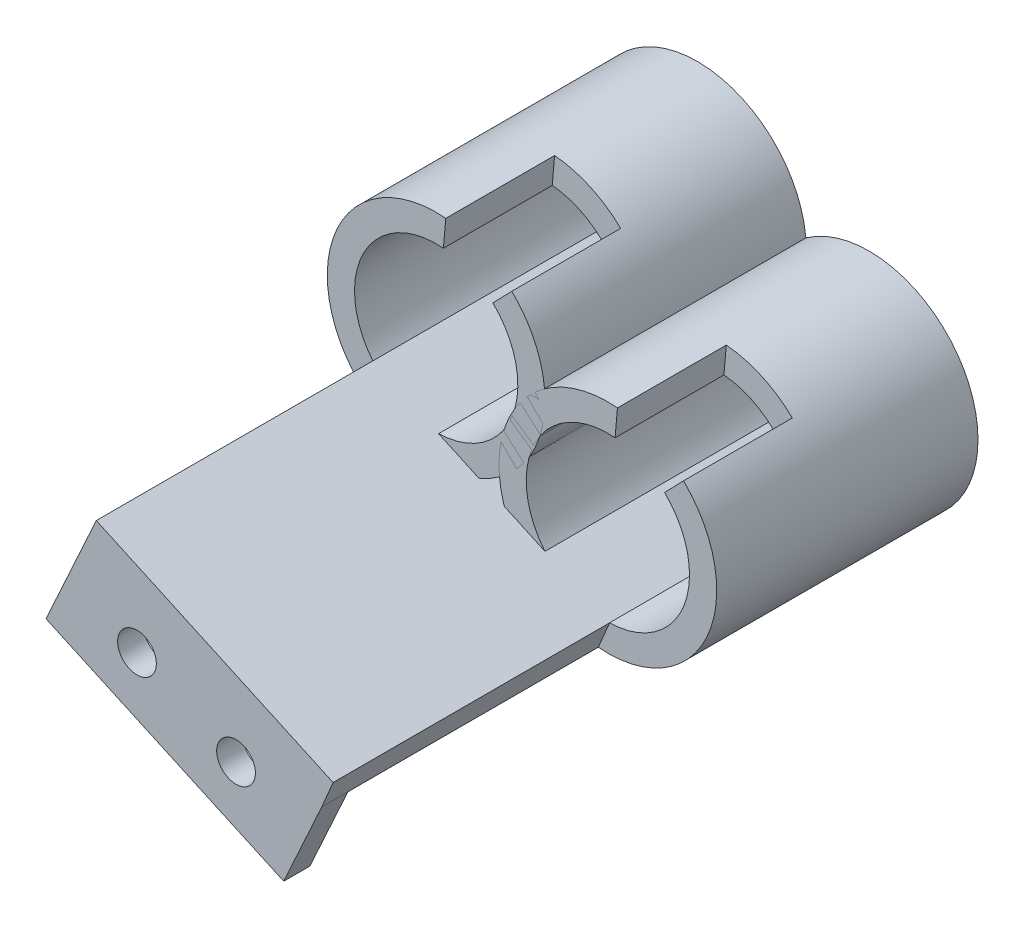
ISO-10303-21;
HEADER;
FILE_DESCRIPTION(('STEP AP214'),'2;1');
FILE_NAME('part.step','',(''),(''),'','','');
FILE_SCHEMA(('AUTOMOTIVE_DESIGN { 1 0 10303 214 1 1 1 1 }'));
ENDSEC;
DATA;
#1=APPLICATION_CONTEXT('core data for automotive mechanical design processes');
#2=APPLICATION_PROTOCOL_DEFINITION('international standard','automotive_design',2000,#1);
#3=PRODUCT_CONTEXT('',#1,'mechanical');
#4=PRODUCT('Part','Part','',(#3));
#5=PRODUCT_RELATED_PRODUCT_CATEGORY('part','',(#4));
#6=PRODUCT_DEFINITION_FORMATION('','',#4);
#7=PRODUCT_DEFINITION_CONTEXT('part definition',#1,'design');
#8=PRODUCT_DEFINITION('design','',#6,#7);
#9=PRODUCT_DEFINITION_SHAPE('','',#8);
#10=(LENGTH_UNIT() NAMED_UNIT(*) SI_UNIT(.MILLI.,.METRE.));
#11=(NAMED_UNIT(*) PLANE_ANGLE_UNIT() SI_UNIT($,.RADIAN.));
#12=(NAMED_UNIT(*) SI_UNIT($,.STERADIAN.) SOLID_ANGLE_UNIT());
#13=UNCERTAINTY_MEASURE_WITH_UNIT(LENGTH_MEASURE(1.E-05),#10,'distance_accuracy_value','');
#14=(GEOMETRIC_REPRESENTATION_CONTEXT(3) GLOBAL_UNCERTAINTY_ASSIGNED_CONTEXT((#13)) GLOBAL_UNIT_ASSIGNED_CONTEXT((#10,
#11,#12)) REPRESENTATION_CONTEXT('',''));
#15=CARTESIAN_POINT('',(0.,0.,0.));
#16=DIRECTION('',(0.,0.,1.));
#17=DIRECTION('',(1.,0.,0.));
#18=AXIS2_PLACEMENT_3D('',#15,#16,#17);
#19=CARTESIAN_POINT('',(15.3328608844258,0.365893564889776,20.9143314535494));
#20=DIRECTION('',(-0.415073445065464,-0.909787906713146,0.));
#21=DIRECTION('',(0.909787906713146,-0.415073445065464,0.));
#22=AXIS2_PLACEMENT_3D('',#19,#20,#21);
#23=PLANE('',#22);
#24=DIRECTION('',(0.,0.,1.));
#25=VECTOR('',#24,1.);
#26=CARTESIAN_POINT('',(15.3328608844258,0.365893564889776,20.9143314535494));
#27=LINE('',#26,#25);
#28=CARTESIAN_POINT('',(15.3328608844258,0.365893564889776,20.9143314535494));
#29=VERTEX_POINT('',#28);
#30=CARTESIAN_POINT('',(15.3328608844258,0.365893564889779,66.5203314535494));
#31=VERTEX_POINT('',#30);
#32=EDGE_CURVE('P0_E11',#29,#31,#27,.T.);
#33=ORIENTED_EDGE('',*,*,#32,.T.);
#34=DIRECTION('',(0.909787906713145,-0.415073445065464,0.));
#35=VECTOR('',#34,1.);
#36=CARTESIAN_POINT('',(-6.50281246817029,10.3280046205645,66.5203314535494));
#37=LINE('',#36,#35);
#38=CARTESIAN_POINT('',(-6.50281246817029,10.3280046205645,66.5203314535494));
#39=VERTEX_POINT('',#38);
#40=EDGE_CURVE('P0_E155',#39,#31,#37,.T.);
#41=ORIENTED_EDGE('',*,*,#40,.F.);
#42=DIRECTION('',(0.,0.,1.));
#43=VECTOR('',#42,1.);
#44=CARTESIAN_POINT('',(-6.50281246817029,10.3280046205645,20.9143314535494));
#45=LINE('',#44,#43);
#46=CARTESIAN_POINT('',(-6.50281246817029,10.3280046205645,20.9143314535494));
#47=VERTEX_POINT('',#46);
#48=EDGE_CURVE('P0_E42',#47,#39,#45,.T.);
#49=ORIENTED_EDGE('',*,*,#48,.F.);
#50=DIRECTION('',(0.909787906713146,-0.415073445065464,0.));
#51=VECTOR('',#50,1.);
#52=CARTESIAN_POINT('',(15.3328608844258,0.365893564889776,20.9143314535494));
#53=LINE('',#52,#51);
#54=EDGE_CURVE('P0_E145',#47,#29,#53,.T.);
#55=ORIENTED_EDGE('',*,*,#54,.T.);
#56=EDGE_LOOP('',(#33,#41,#49,#55));
#57=FACE_BOUND('',#56,.T.);
#58=ADVANCED_FACE('P0_F33',(#57),#23,.T.);
#59=CARTESIAN_POINT('',(15.3328608844258,0.365893564889776,20.9143314535494));
#60=DIRECTION('',(0.908709466234053,-0.41742916282481,0.));
#61=DIRECTION('',(0.41742916282481,0.908709466234053,0.));
#62=AXIS2_PLACEMENT_3D('',#59,#60,#61);
#63=PLANE('',#62);
#64=DIRECTION('',(0.,0.,1.));
#65=VECTOR('',#64,1.);
#66=CARTESIAN_POINT('',(15.3446784619629,0.391619473695926,20.9143314535494));
#67=LINE('',#66,#65);
#68=CARTESIAN_POINT('',(15.3446784619629,0.391619473695926,20.9143314535494));
#69=VERTEX_POINT('',#68);
#70=CARTESIAN_POINT('',(15.3446784619629,0.391619473695926,68.9203314535494));
#71=VERTEX_POINT('',#70);
#72=EDGE_CURVE('P0_E146',#69,#71,#67,.T.);
#73=ORIENTED_EDGE('',*,*,#72,.T.);
#74=DIRECTION('',(0.41742916282481,0.908709466234053,0.));
#75=VECTOR('',#74,1.);
#76=CARTESIAN_POINT('',(15.3328608844258,0.365893564889776,68.9203314535494));
#77=LINE('',#76,#75);
#78=CARTESIAN_POINT('',(15.3328608844258,0.365893564889776,68.9203314535494));
#79=VERTEX_POINT('',#78);
#80=EDGE_CURVE('P0_E119',#79,#71,#77,.T.);
#81=ORIENTED_EDGE('',*,*,#80,.F.);
#82=DIRECTION('',(0.,0.,1.));
#83=VECTOR('',#82,1.);
#84=CARTESIAN_POINT('',(15.3328608844258,0.365893564889779,68.9203314535494));
#85=LINE('',#84,#83);
#86=EDGE_CURVE('P0_E116',#31,#79,#85,.T.);
#87=ORIENTED_EDGE('',*,*,#86,.F.);
#88=ORIENTED_EDGE('',*,*,#32,.F.);
#89=DIRECTION('',(0.41742916282481,0.908709466234053,0.));
#90=VECTOR('',#89,1.);
#91=CARTESIAN_POINT('',(15.3328608844258,0.365893564889776,20.9143314535494));
#92=LINE('',#91,#90);
#93=EDGE_CURVE('P0_E135',#29,#69,#92,.T.);
#94=ORIENTED_EDGE('',*,*,#93,.T.);
#95=EDGE_LOOP('',(#73,#81,#87,#88,#94));
#96=FACE_BOUND('',#95,.T.);
#97=ADVANCED_FACE('P0_F35',(#96),#63,.T.);
#98=CARTESIAN_POINT('',(-6.50281246817029,10.3280046205645,20.9143314535494));
#99=DIRECTION('',(-0.909787906713146,0.415073445065464,0.));
#100=DIRECTION('',(-0.415073445065464,-0.909787906713146,0.));
#101=AXIS2_PLACEMENT_3D('',#98,#99,#100);
#102=PLANE('',#101);
#103=ORIENTED_EDGE('',*,*,#48,.T.);
#104=DIRECTION('',(0.415073445065464,0.909787906713146,0.));
#105=VECTOR('',#104,1.);
#106=CARTESIAN_POINT('',(-9.9977308756215,2.66759044603985,66.5203314535494));
#107=LINE('',#106,#105);
#108=CARTESIAN_POINT('',(-9.9977308756215,2.66759044603985,66.5203314535494));
#109=VERTEX_POINT('',#108);
#110=EDGE_CURVE('P0_E101',#109,#39,#107,.T.);
#111=ORIENTED_EDGE('',*,*,#110,.F.);
#112=DIRECTION('',(0.,0.,-1.));
#113=VECTOR('',#112,1.);
#114=CARTESIAN_POINT('',(-9.9977308756215,2.66759044603984,68.9203314535494));
#115=LINE('',#114,#113);
#116=CARTESIAN_POINT('',(-9.9977308756215,2.66759044603984,68.9203314535494));
#117=VERTEX_POINT('',#116);
#118=EDGE_CURVE('P0_E107',#117,#109,#115,.T.);
#119=ORIENTED_EDGE('',*,*,#118,.F.);
#120=DIRECTION('',(-0.415073445065464,-0.909787906713146,0.));
#121=VECTOR('',#120,1.);
#122=CARTESIAN_POINT('',(-6.50281246817029,10.3280046205645,68.9203314535494));
#123=LINE('',#122,#121);
#124=CARTESIAN_POINT('',(-5.37815341438028,12.7931134307709,68.9203314535494));
#125=VERTEX_POINT('',#124);
#126=EDGE_CURVE('P0_E133',#125,#117,#123,.T.);
#127=ORIENTED_EDGE('',*,*,#126,.F.);
#128=DIRECTION('',(0.,0.,1.));
#129=VECTOR('',#128,1.);
#130=CARTESIAN_POINT('',(-5.37815341438028,12.7931134307709,20.9143314535494));
#131=LINE('',#130,#129);
#132=CARTESIAN_POINT('',(-5.37815341438028,12.7931134307709,20.9143314535494));
#133=VERTEX_POINT('',#132);
#134=EDGE_CURVE('P0_E149',#133,#125,#131,.T.);
#135=ORIENTED_EDGE('',*,*,#134,.F.);
#136=DIRECTION('',(-0.415073445065464,-0.909787906713146,0.));
#137=VECTOR('',#136,1.);
#138=CARTESIAN_POINT('',(-6.50281246817029,10.3280046205645,20.9143314535494));
#139=LINE('',#138,#137);
#140=EDGE_CURVE('P0_E143',#133,#47,#139,.T.);
#141=ORIENTED_EDGE('',*,*,#140,.T.);
#142=EDGE_LOOP('',(#103,#111,#119,#127,#135,#141));
#143=FACE_BOUND('',#142,.T.);
#144=ADVANCED_FACE('P0_F118',(#143),#102,.T.);
#145=CARTESIAN_POINT('',(-5.37815341438028,12.7931134307709,20.9143314535494));
#146=DIRECTION('',(0.416449611726263,0.909158798501695,0.));
#147=DIRECTION('',(-0.909158798501695,0.416449611726263,0.));
#148=AXIS2_PLACEMENT_3D('',#145,#146,#147);
#149=PLANE('',#148);
#150=ORIENTED_EDGE('',*,*,#134,.T.);
#151=DIRECTION('',(-0.909158798501695,0.416449611726263,0.));
#152=VECTOR('',#151,1.);
#153=CARTESIAN_POINT('',(-5.37815341438028,12.7931134307709,68.9203314535494));
#154=LINE('',#153,#152);
#155=CARTESIAN_POINT('',(16.3751761156052,2.82877535094867,68.9203314535494));
#156=VERTEX_POINT('',#155);
#157=EDGE_CURVE('P0_E130',#156,#125,#154,.T.);
#158=ORIENTED_EDGE('',*,*,#157,.F.);
#159=DIRECTION('',(0.,0.,1.));
#160=VECTOR('',#159,1.);
#161=CARTESIAN_POINT('',(16.3751761156052,2.82877535094867,20.9143314535494));
#162=LINE('',#161,#160);
#163=CARTESIAN_POINT('',(16.3751761156052,2.82877535094867,20.9143314535494));
#164=VERTEX_POINT('',#163);
#165=EDGE_CURVE('P0_E151',#164,#156,#162,.T.);
#166=ORIENTED_EDGE('',*,*,#165,.F.);
#167=DIRECTION('',(-0.909158798501695,0.416449611726263,0.));
#168=VECTOR('',#167,1.);
#169=CARTESIAN_POINT('',(-5.37815341438028,12.7931134307709,20.9143314535494));
#170=LINE('',#169,#168);
#171=EDGE_CURVE('P0_E140',#164,#133,#170,.T.);
#172=ORIENTED_EDGE('',*,*,#171,.T.);
#173=EDGE_LOOP('',(#150,#158,#166,#172));
#174=FACE_BOUND('',#173,.T.);
#175=ADVANCED_FACE('P0_F183',(#174),#149,.T.);
#176=CARTESIAN_POINT('',(15.3446784619629,0.391619473695926,20.9143314535494));
#177=DIRECTION('',(0.921049515676657,-0.389445489987746,0.));
#178=DIRECTION('',(0.389445489987746,0.921049515676657,0.));
#179=AXIS2_PLACEMENT_3D('',#176,#177,#178);
#180=PLANE('',#179);
#181=ORIENTED_EDGE('',*,*,#165,.T.);
#182=DIRECTION('',(0.389445489987746,0.921049515676657,0.));
#183=VECTOR('',#182,1.);
#184=CARTESIAN_POINT('',(15.3446784619629,0.391619473695926,68.9203314535494));
#185=LINE('',#184,#183);
#186=EDGE_CURVE('P0_E122',#71,#156,#185,.T.);
#187=ORIENTED_EDGE('',*,*,#186,.F.);
#188=ORIENTED_EDGE('',*,*,#72,.F.);
#189=DIRECTION('',(0.389445489987746,0.921049515676657,0.));
#190=VECTOR('',#189,1.);
#191=CARTESIAN_POINT('',(15.3446784619629,0.391619473695926,20.9143314535494));
#192=LINE('',#191,#190);
#193=EDGE_CURVE('P0_E137',#69,#164,#192,.T.);
#194=ORIENTED_EDGE('',*,*,#193,.T.);
#195=EDGE_LOOP('',(#181,#187,#188,#194));
#196=FACE_BOUND('',#195,.T.);
#197=ADVANCED_FACE('P0_F180',(#196),#180,.T.);
#198=CARTESIAN_POINT('',(0.,0.,20.9143314535494));
#199=DIRECTION('',(0.,0.,-1.));
#200=DIRECTION('',(-1.,0.,0.));
#201=AXIS2_PLACEMENT_3D('',#198,#199,#200);
#202=PLANE('',#201);
#203=ORIENTED_EDGE('',*,*,#93,.F.);
#204=ORIENTED_EDGE('',*,*,#54,.F.);
#205=ORIENTED_EDGE('',*,*,#140,.F.);
#206=ORIENTED_EDGE('',*,*,#171,.F.);
#207=ORIENTED_EDGE('',*,*,#193,.F.);
#208=EDGE_LOOP('',(#203,#204,#205,#206,#207));
#209=FACE_BOUND('',#208,.T.);
#210=ADVANCED_FACE('P0_F188',(#209),#202,.T.);
#211=CARTESIAN_POINT('',(0.,0.,68.9203314535494));
#212=DIRECTION('',(0.,0.,-1.));
#213=DIRECTION('',(-1.,0.,0.));
#214=AXIS2_PLACEMENT_3D('',#211,#212,#213);
#215=PLANE('',#214);
#216=CARTESIAN_POINT('',(-1.64033311629287,4.15921955018549,68.9203314535494));
#217=DIRECTION('',(0.,0.,1.));
#218=DIRECTION('',(1.,0.,0.));
#219=AXIS2_PLACEMENT_3D('',#216,#217,#218);
#220=CIRCLE('',#219,1.778);
#221=CARTESIAN_POINT('',(0.137666883707133,4.15921955018549,68.9203314535494));
#222=VERTEX_POINT('',#221);
#223=EDGE_CURVE('P0_E165',#222,#222,#220,.T.);
#224=ORIENTED_EDGE('',*,*,#223,.F.);
#225=EDGE_LOOP('',(#224));
#226=FACE_BOUND('',#225,.T.);
#227=CARTESIAN_POINT('',(7.45759637822947,0.0084620929919621,68.9203314535494));
#228=DIRECTION('',(0.,0.,1.));
#229=DIRECTION('',(1.,0.,0.));
#230=AXIS2_PLACEMENT_3D('',#227,#228,#229);
#231=CIRCLE('',#230,1.778);
#232=CARTESIAN_POINT('',(9.23559637822947,0.0084620929919621,68.9203314535494));
#233=VERTEX_POINT('',#232);
#234=EDGE_CURVE('P0_E156',#233,#233,#231,.T.);
#235=ORIENTED_EDGE('',*,*,#234,.F.);
#236=EDGE_LOOP('',(#235));
#237=FACE_BOUND('',#236,.T.);
#238=ORIENTED_EDGE('',*,*,#80,.T.);
#239=ORIENTED_EDGE('',*,*,#186,.T.);
#240=ORIENTED_EDGE('',*,*,#157,.T.);
#241=ORIENTED_EDGE('',*,*,#126,.T.);
#242=DIRECTION('',(-0.909787906713146,0.415073445065464,0.));
#243=VECTOR('',#242,1.);
#244=CARTESIAN_POINT('',(-9.9977308756215,2.66759044603984,68.9203314535494));
#245=LINE('',#244,#243);
#246=CARTESIAN_POINT('',(11.8379424769746,-7.29452060963491,68.9203314535494));
#247=VERTEX_POINT('',#246);
#248=EDGE_CURVE('P0_E113',#247,#117,#245,.T.);
#249=ORIENTED_EDGE('',*,*,#248,.F.);
#250=DIRECTION('',(0.415073445065464,0.909787906713146,0.));
#251=VECTOR('',#250,1.);
#252=CARTESIAN_POINT('',(11.8379424769746,-7.29452060963491,68.9203314535494));
#253=LINE('',#252,#251);
#254=EDGE_CURVE('P0_E124',#247,#79,#253,.T.);
#255=ORIENTED_EDGE('',*,*,#254,.T.);
#256=EDGE_LOOP('',(#238,#239,#240,#241,#249,#255));
#257=FACE_BOUND('',#256,.T.);
#258=ADVANCED_FACE('P0_F173',(#226,#237,#257),#215,.F.);
#259=CARTESIAN_POINT('',(-9.9977308756215,2.66759044603985,66.5203314535494));
#260=DIRECTION('',(0.,0.,1.));
#261=DIRECTION('',(1.,0.,0.));
#262=AXIS2_PLACEMENT_3D('',#259,#260,#261);
#263=PLANE('',#262);
#264=CARTESIAN_POINT('',(-1.64033311629287,4.15921955018549,66.5203314535494));
#265=DIRECTION('',(0.,0.,1.));
#266=DIRECTION('',(1.,0.,0.));
#267=AXIS2_PLACEMENT_3D('',#264,#265,#266);
#268=CIRCLE('',#267,1.778);
#269=CARTESIAN_POINT('',(0.137666883707133,4.15921955018549,66.5203314535494));
#270=VERTEX_POINT('',#269);
#271=EDGE_CURVE('P0_E37',#270,#270,#268,.T.);
#272=ORIENTED_EDGE('',*,*,#271,.T.);
#273=EDGE_LOOP('',(#272));
#274=FACE_BOUND('',#273,.T.);
#275=CARTESIAN_POINT('',(7.45759637822947,0.0084620929919621,66.5203314535494));
#276=DIRECTION('',(0.,0.,1.));
#277=DIRECTION('',(1.,0.,0.));
#278=AXIS2_PLACEMENT_3D('',#275,#276,#277);
#279=CIRCLE('',#278,1.778);
#280=CARTESIAN_POINT('',(9.23559637822947,0.0084620929919621,66.5203314535494));
#281=VERTEX_POINT('',#280);
#282=EDGE_CURVE('P0_E153',#281,#281,#279,.T.);
#283=ORIENTED_EDGE('',*,*,#282,.T.);
#284=EDGE_LOOP('',(#283));
#285=FACE_BOUND('',#284,.T.);
#286=ORIENTED_EDGE('',*,*,#40,.T.);
#287=DIRECTION('',(0.415073445065464,0.909787906713146,0.));
#288=VECTOR('',#287,1.);
#289=CARTESIAN_POINT('',(11.8379424769746,-7.29452060963491,66.5203314535494));
#290=LINE('',#289,#288);
#291=CARTESIAN_POINT('',(11.8379424769746,-7.29452060963491,66.5203314535494));
#292=VERTEX_POINT('',#291);
#293=EDGE_CURVE('P0_E103',#292,#31,#290,.T.);
#294=ORIENTED_EDGE('',*,*,#293,.F.);
#295=DIRECTION('',(0.909787906713145,-0.415073445065464,0.));
#296=VECTOR('',#295,1.);
#297=CARTESIAN_POINT('',(-9.9977308756215,2.66759044603985,66.5203314535494));
#298=LINE('',#297,#296);
#299=EDGE_CURVE('P0_E97',#109,#292,#298,.T.);
#300=ORIENTED_EDGE('',*,*,#299,.F.);
#301=ORIENTED_EDGE('',*,*,#110,.T.);
#302=EDGE_LOOP('',(#286,#294,#300,#301));
#303=FACE_BOUND('',#302,.T.);
#304=ADVANCED_FACE('P0_F99',(#274,#285,#303),#263,.F.);
#305=CARTESIAN_POINT('',(11.8379424769746,-7.29452060963491,68.9203314535494));
#306=DIRECTION('',(-0.909787906713146,0.415073445065464,0.));
#307=DIRECTION('',(-0.415073445065464,-0.909787906713146,0.));
#308=AXIS2_PLACEMENT_3D('',#305,#306,#307);
#309=PLANE('',#308);
#310=ORIENTED_EDGE('',*,*,#86,.T.);
#311=ORIENTED_EDGE('',*,*,#254,.F.);
#312=DIRECTION('',(0.,0.,1.));
#313=VECTOR('',#312,1.);
#314=CARTESIAN_POINT('',(11.8379424769746,-7.29452060963491,68.9203314535494));
#315=LINE('',#314,#313);
#316=EDGE_CURVE('P0_E106',#292,#247,#315,.T.);
#317=ORIENTED_EDGE('',*,*,#316,.F.);
#318=ORIENTED_EDGE('',*,*,#293,.T.);
#319=EDGE_LOOP('',(#310,#311,#317,#318));
#320=FACE_BOUND('',#319,.T.);
#321=ADVANCED_FACE('P0_F176',(#320),#309,.F.);
#322=CARTESIAN_POINT('',(-0.715109728756639,-1.56742906810889,0.));
#323=DIRECTION('',(-0.415073445065464,-0.909787906713146,0.));
#324=DIRECTION('',(0.909787906713146,-0.415073445065464,0.));
#325=AXIS2_PLACEMENT_3D('',#322,#323,#324);
#326=PLANE('',#325);
#327=ORIENTED_EDGE('',*,*,#118,.T.);
#328=ORIENTED_EDGE('',*,*,#299,.T.);
#329=ORIENTED_EDGE('',*,*,#316,.T.);
#330=ORIENTED_EDGE('',*,*,#248,.T.);
#331=EDGE_LOOP('',(#327,#328,#329,#330));
#332=FACE_BOUND('',#331,.T.);
#333=ADVANCED_FACE('P0_F111',(#332),#326,.T.);
#334=CARTESIAN_POINT('',(7.45759637822947,0.0084620929919621,66.3803314535494));
#335=DIRECTION('',(0.,0.,1.));
#336=DIRECTION('',(1.,0.,0.));
#337=AXIS2_PLACEMENT_3D('',#334,#335,#336);
#338=CYLINDRICAL_SURFACE('',#337,1.778);
#339=ORIENTED_EDGE('',*,*,#234,.T.);
#340=EDGE_LOOP('',(#339));
#341=FACE_BOUND('',#340,.T.);
#342=ORIENTED_EDGE('',*,*,#282,.F.);
#343=EDGE_LOOP('',(#342));
#344=FACE_BOUND('',#343,.T.);
#345=ADVANCED_FACE('P0_F220',(#341,#344),#338,.F.);
#346=CARTESIAN_POINT('',(-1.64033311629287,4.15921955018549,66.3803314535494));
#347=DIRECTION('',(0.,0.,1.));
#348=DIRECTION('',(1.,0.,0.));
#349=AXIS2_PLACEMENT_3D('',#346,#347,#348);
#350=CYLINDRICAL_SURFACE('',#349,1.778);
#351=ORIENTED_EDGE('',*,*,#223,.T.);
#352=EDGE_LOOP('',(#351));
#353=FACE_BOUND('',#352,.T.);
#354=ORIENTED_EDGE('',*,*,#271,.F.);
#355=EDGE_LOOP('',(#354));
#356=FACE_BOUND('',#355,.T.);
#357=ADVANCED_FACE('P0_F223',(#353,#356),#350,.F.);
#358=CLOSED_SHELL('',(#58,#97,#144,#175,#197,#210,#258,#304,#321,#333,#345,#357));
#359=MANIFOLD_SOLID_BREP('P0_B2',#358);
#360=CARTESIAN_POINT('',(16.2135844979987,10.3270343588197,21.5203314535494));
#361=DIRECTION('',(0.,0.,-1.));
#362=DIRECTION('',(-1.,0.,0.));
#363=AXIS2_PLACEMENT_3D('',#360,#361,#362);
#364=CYLINDRICAL_SURFACE('',#363,3.285);
#365=CARTESIAN_POINT('',(16.2135844979987,10.3270343588197,21.5203314535494));
#366=DIRECTION('',(0.,0.,1.));
#367=DIRECTION('',(1.,0.,0.));
#368=AXIS2_PLACEMENT_3D('',#365,#366,#367);
#369=CIRCLE('',#368,3.285);
#370=CARTESIAN_POINT('',(19.4985844979987,10.3270343588197,21.5203314535494));
#371=VERTEX_POINT('',#370);
#372=EDGE_CURVE('P1_E11',#371,#371,#369,.T.);
#373=ORIENTED_EDGE('',*,*,#372,.T.);
#374=EDGE_LOOP('',(#373));
#375=FACE_BOUND('',#374,.T.);
#376=CARTESIAN_POINT('',(16.2135844979987,10.3270343588197,19.5203314535494));
#377=DIRECTION('',(0.,0.,1.));
#378=DIRECTION('',(1.,0.,0.));
#379=AXIS2_PLACEMENT_3D('',#376,#377,#378);
#380=CIRCLE('',#379,3.285);
#381=CARTESIAN_POINT('',(19.4985844979987,10.3270343588197,19.5203314535494));
#382=VERTEX_POINT('',#381);
#383=EDGE_CURVE('P1_E22',#382,#382,#380,.T.);
#384=ORIENTED_EDGE('',*,*,#383,.F.);
#385=EDGE_LOOP('',(#384));
#386=FACE_BOUND('',#385,.T.);
#387=ADVANCED_FACE('P1_F16',(#375,#386),#364,.F.);
#388=CARTESIAN_POINT('',(16.2135844979987,10.3270343588197,19.5203314535494));
#389=DIRECTION('',(0.,0.,1.));
#390=DIRECTION('',(1.,0.,0.));
#391=AXIS2_PLACEMENT_3D('',#388,#389,#390);
#392=PLANE('',#391);
#393=ORIENTED_EDGE('',*,*,#383,.T.);
#394=EDGE_LOOP('',(#393));
#395=FACE_BOUND('',#394,.T.);
#396=CARTESIAN_POINT('',(16.2135844979987,10.3270343588197,19.5203314535494));
#397=DIRECTION('',(0.,0.,1.));
#398=DIRECTION('',(1.,0.,0.));
#399=AXIS2_PLACEMENT_3D('',#396,#397,#398);
#400=CIRCLE('',#399,10.);
#401=CARTESIAN_POINT('',(26.2135844979987,10.3270343588197,19.5203314535494));
#402=VERTEX_POINT('',#401);
#403=EDGE_CURVE('P1_E139',#402,#402,#400,.T.);
#404=ORIENTED_EDGE('',*,*,#403,.F.);
#405=EDGE_LOOP('',(#404));
#406=FACE_BOUND('',#405,.T.);
#407=ADVANCED_FACE('P1_F158',(#395,#406),#392,.F.);
#408=CARTESIAN_POINT('',(16.2135844979987,10.3270343588197,43.5203314535494));
#409=DIRECTION('',(0.996114079392994,-0.0880723613572865,0.));
#410=DIRECTION('',(0.0880723613572865,0.996114079392994,0.));
#411=AXIS2_PLACEMENT_3D('',#408,#409,#410);
#412=PLANE('',#411);
#413=DIRECTION('',(-0.0880723613572865,-0.996114079392994,0.));
#414=VECTOR('',#413,1.);
#415=CARTESIAN_POINT('',(16.2135844979987,10.3270343588197,33.5203314535494));
#416=LINE('',#415,#414);
#417=CARTESIAN_POINT('',(15.553041787819,2.85617876337226,33.5203314535494));
#418=VERTEX_POINT('',#417);
#419=CARTESIAN_POINT('',(15.3328608844258,0.365893564889776,33.5203314535494));
#420=VERTEX_POINT('',#419);
#421=EDGE_CURVE('P1_E126',#418,#420,#416,.T.);
#422=ORIENTED_EDGE('',*,*,#421,.T.);
#423=DIRECTION('',(0.,0.,-1.));
#424=VECTOR('',#423,1.);
#425=CARTESIAN_POINT('',(15.3328608844258,0.365893564889776,43.5203314535494));
#426=LINE('',#425,#424);
#427=CARTESIAN_POINT('',(15.3328608844258,0.365893564889776,43.5203314535494));
#428=VERTEX_POINT('',#427);
#429=EDGE_CURVE('P1_E96',#428,#420,#426,.T.);
#430=ORIENTED_EDGE('',*,*,#429,.F.);
#431=DIRECTION('',(-0.0880723613572865,-0.996114079392994,0.));
#432=VECTOR('',#431,1.);
#433=CARTESIAN_POINT('',(16.2135844979987,10.3270343588197,43.5203314535494));
#434=LINE('',#433,#432);
#435=CARTESIAN_POINT('',(15.553041787819,2.85617876337226,43.5203314535494));
#436=VERTEX_POINT('',#435);
#437=EDGE_CURVE('P1_E80',#436,#428,#434,.T.);
#438=ORIENTED_EDGE('',*,*,#437,.F.);
#439=DIRECTION('',(0.,0.,-1.));
#440=VECTOR('',#439,1.);
#441=CARTESIAN_POINT('',(15.553041787819,2.85617876337226,43.5203314535494));
#442=LINE('',#441,#440);
#443=EDGE_CURVE('P1_E93',#436,#418,#442,.T.);
#444=ORIENTED_EDGE('',*,*,#443,.T.);
#445=EDGE_LOOP('',(#422,#430,#438,#444));
#446=FACE_BOUND('',#445,.T.);
#447=ADVANCED_FACE('P1_F92',(#446),#412,.F.);
#448=CARTESIAN_POINT('',(16.2135844979987,10.3270343588197,43.5203314535494));
#449=DIRECTION('',(-0.719398449349351,0.694597632499383,0.));
#450=DIRECTION('',(-0.694597632499383,-0.719398449349351,0.));
#451=AXIS2_PLACEMENT_3D('',#448,#449,#450);
#452=PLANE('',#451);
#453=DIRECTION('',(0.694597632499383,0.719398449349351,0.));
#454=VECTOR('',#453,1.);
#455=CARTESIAN_POINT('',(16.2135844979987,10.3270343588197,33.5203314535494));
#456=LINE('',#455,#454);
#457=CARTESIAN_POINT('',(21.4230667417441,15.7225227289398,33.5203314535494));
#458=VERTEX_POINT('',#457);
#459=CARTESIAN_POINT('',(23.1595608229925,17.5210188523132,33.5203314535494));
#460=VERTEX_POINT('',#459);
#461=EDGE_CURVE('P1_E151',#458,#460,#456,.T.);
#462=ORIENTED_EDGE('',*,*,#461,.F.);
#463=DIRECTION('',(0.,0.,-1.));
#464=VECTOR('',#463,1.);
#465=CARTESIAN_POINT('',(21.4230667417441,15.7225227289398,43.5203314535494));
#466=LINE('',#465,#464);
#467=CARTESIAN_POINT('',(21.4230667417441,15.7225227289398,43.5203314535494));
#468=VERTEX_POINT('',#467);
#469=EDGE_CURVE('P1_E102',#468,#458,#466,.T.);
#470=ORIENTED_EDGE('',*,*,#469,.F.);
#471=DIRECTION('',(0.694597632499383,0.719398449349351,0.));
#472=VECTOR('',#471,1.);
#473=CARTESIAN_POINT('',(16.2135844979987,10.3270343588197,43.5203314535494));
#474=LINE('',#473,#472);
#475=CARTESIAN_POINT('',(23.1595608229925,17.5210188523132,43.5203314535494));
#476=VERTEX_POINT('',#475);
#477=EDGE_CURVE('P1_E83',#468,#476,#474,.T.);
#478=ORIENTED_EDGE('',*,*,#477,.T.);
#479=DIRECTION('',(0.,0.,-1.));
#480=VECTOR('',#479,1.);
#481=CARTESIAN_POINT('',(23.1595608229925,17.5210188523132,43.5203314535494));
#482=LINE('',#481,#480);
#483=EDGE_CURVE('P1_E134',#476,#460,#482,.T.);
#484=ORIENTED_EDGE('',*,*,#483,.T.);
#485=EDGE_LOOP('',(#462,#470,#478,#484));
#486=FACE_BOUND('',#485,.T.);
#487=ADVANCED_FACE('P1_F171',(#486),#452,.T.);
#488=CARTESIAN_POINT('',(16.2135844979987,10.3270343588197,33.5203314535494));
#489=DIRECTION('',(0.,0.,1.));
#490=DIRECTION('',(1.,0.,0.));
#491=AXIS2_PLACEMENT_3D('',#488,#489,#490);
#492=PLANE('',#491);
#493=ORIENTED_EDGE('',*,*,#461,.T.);
#494=CARTESIAN_POINT('',(16.2135844979987,10.3270343588197,33.5203314535494));
#495=DIRECTION('',(0.,0.,1.));
#496=DIRECTION('',(1.,0.,0.));
#497=AXIS2_PLACEMENT_3D('',#494,#495,#496);
#498=CIRCLE('',#497,10.);
#499=CARTESIAN_POINT('',(17.0943081115716,20.2881751527497,33.5203314535494));
#500=VERTEX_POINT('',#499);
#501=EDGE_CURVE('P1_E29',#460,#500,#498,.T.);
#502=ORIENTED_EDGE('',*,*,#501,.T.);
#503=DIRECTION('',(0.0880723613572865,0.996114079392994,0.));
#504=VECTOR('',#503,1.);
#505=CARTESIAN_POINT('',(16.2135844979987,10.3270343588197,33.5203314535494));
#506=LINE('',#505,#504);
#507=CARTESIAN_POINT('',(16.8741272081783,17.7978899542672,33.5203314535494));
#508=VERTEX_POINT('',#507);
#509=EDGE_CURVE('P1_E148',#508,#500,#506,.T.);
#510=ORIENTED_EDGE('',*,*,#509,.F.);
#511=CARTESIAN_POINT('',(16.2135844979987,10.3270343588197,33.5203314535494));
#512=DIRECTION('',(0.,0.,1.));
#513=DIRECTION('',(1.,0.,0.));
#514=AXIS2_PLACEMENT_3D('',#511,#512,#513);
#515=CIRCLE('',#514,7.5);
#516=EDGE_CURVE('P1_E104',#458,#508,#515,.T.);
#517=ORIENTED_EDGE('',*,*,#516,.F.);
#518=EDGE_LOOP('',(#493,#502,#510,#517));
#519=FACE_BOUND('',#518,.T.);
#520=ADVANCED_FACE('P1_F176',(#519),#492,.T.);
#521=CARTESIAN_POINT('',(16.2135844979987,10.3270343588197,43.5203314535494));
#522=DIRECTION('',(-0.996114079392994,0.0880723613572865,0.));
#523=DIRECTION('',(-0.0880723613572865,-0.996114079392994,0.));
#524=AXIS2_PLACEMENT_3D('',#521,#522,#523);
#525=PLANE('',#524);
#526=ORIENTED_EDGE('',*,*,#509,.T.);
#527=DIRECTION('',(0.,0.,-1.));
#528=VECTOR('',#527,1.);
#529=CARTESIAN_POINT('',(17.0943081115716,20.2881751527497,43.5203314535494));
#530=LINE('',#529,#528);
#531=CARTESIAN_POINT('',(17.0943081115716,20.2881751527497,43.5203314535494));
#532=VERTEX_POINT('',#531);
#533=EDGE_CURVE('P1_E34',#532,#500,#530,.T.);
#534=ORIENTED_EDGE('',*,*,#533,.F.);
#535=DIRECTION('',(0.0880723613572865,0.996114079392994,0.));
#536=VECTOR('',#535,1.);
#537=CARTESIAN_POINT('',(16.2135844979987,10.3270343588197,43.5203314535494));
#538=LINE('',#537,#536);
#539=CARTESIAN_POINT('',(16.8741272081783,17.7978899542672,43.5203314535494));
#540=VERTEX_POINT('',#539);
#541=EDGE_CURVE('P1_E145',#540,#532,#538,.T.);
#542=ORIENTED_EDGE('',*,*,#541,.F.);
#543=DIRECTION('',(0.,0.,-1.));
#544=VECTOR('',#543,1.);
#545=CARTESIAN_POINT('',(16.8741272081783,17.7978899542672,43.5203314535494));
#546=LINE('',#545,#544);
#547=EDGE_CURVE('P1_E112',#540,#508,#546,.T.);
#548=ORIENTED_EDGE('',*,*,#547,.T.);
#549=EDGE_LOOP('',(#526,#534,#542,#548));
#550=FACE_BOUND('',#549,.T.);
#551=ADVANCED_FACE('P1_F178',(#550),#525,.F.);
#552=CARTESIAN_POINT('',(16.2135844979987,10.3270343588197,43.5203314535494));
#553=DIRECTION('',(0.,0.,1.));
#554=DIRECTION('',(1.,0.,0.));
#555=AXIS2_PLACEMENT_3D('',#552,#553,#554);
#556=PLANE('',#555);
#557=CARTESIAN_POINT('',(16.2135844979987,10.3270343588197,43.5203314535494));
#558=DIRECTION('',(0.,0.,1.));
#559=DIRECTION('',(1.,0.,0.));
#560=AXIS2_PLACEMENT_3D('',#557,#558,#559);
#561=CIRCLE('',#560,7.5);
#562=CARTESIAN_POINT('',(11.0041022542533,4.93154598869958,43.5203314535494));
#563=VERTEX_POINT('',#562);
#564=EDGE_CURVE('P1_E115',#563,#540,#561,.F.);
#565=ORIENTED_EDGE('',*,*,#564,.T.);
#566=ORIENTED_EDGE('',*,*,#541,.T.);
#567=CARTESIAN_POINT('',(16.2135844979987,10.3270343588197,43.5203314535494));
#568=DIRECTION('',(0.,0.,1.));
#569=DIRECTION('',(1.,0.,0.));
#570=AXIS2_PLACEMENT_3D('',#567,#568,#569);
#571=CIRCLE('',#570,10.);
#572=CARTESIAN_POINT('',(9.26760817300485,3.1330498653262,43.5203314535494));
#573=VERTEX_POINT('',#572);
#574=EDGE_CURVE('P1_E318',#532,#573,#571,.T.);
#575=ORIENTED_EDGE('',*,*,#574,.T.);
#576=DIRECTION('',(0.694597632499383,0.719398449349352,0.));
#577=VECTOR('',#576,1.);
#578=CARTESIAN_POINT('',(16.2135844979987,10.3270343588197,43.5203314535494));
#579=LINE('',#578,#577);
#580=EDGE_CURVE('P1_E142',#573,#563,#579,.T.);
#581=ORIENTED_EDGE('',*,*,#580,.T.);
#582=EDGE_LOOP('',(#565,#566,#575,#581));
#583=FACE_BOUND('',#582,.T.);
#584=ADVANCED_FACE('P1_F181',(#583),#556,.T.);
#585=CARTESIAN_POINT('',(16.2135844979987,10.3270343588197,43.5203314535494));
#586=DIRECTION('',(-0.719398449349352,0.694597632499383,0.));
#587=DIRECTION('',(-0.694597632499383,-0.719398449349352,0.));
#588=AXIS2_PLACEMENT_3D('',#585,#586,#587);
#589=PLANE('',#588);
#590=DIRECTION('',(0.694597632499383,0.719398449349352,0.));
#591=VECTOR('',#590,1.);
#592=CARTESIAN_POINT('',(16.2135844979987,10.3270343588197,33.5203314535494));
#593=LINE('',#592,#591);
#594=CARTESIAN_POINT('',(9.26760817300485,3.1330498653262,33.5203314535494));
#595=VERTEX_POINT('',#594);
#596=CARTESIAN_POINT('',(11.0041022542533,4.93154598869958,33.5203314535494));
#597=VERTEX_POINT('',#596);
#598=EDGE_CURVE('P1_E315',#595,#597,#593,.T.);
#599=ORIENTED_EDGE('',*,*,#598,.T.);
#600=DIRECTION('',(0.,0.,-1.));
#601=VECTOR('',#600,1.);
#602=CARTESIAN_POINT('',(11.0041022542533,4.93154598869958,43.5203314535494));
#603=LINE('',#602,#601);
#604=EDGE_CURVE('P1_E120',#563,#597,#603,.T.);
#605=ORIENTED_EDGE('',*,*,#604,.F.);
#606=ORIENTED_EDGE('',*,*,#580,.F.);
#607=DIRECTION('',(0.,0.,-1.));
#608=VECTOR('',#607,1.);
#609=CARTESIAN_POINT('',(9.26760817300485,3.1330498653262,43.5203314535494));
#610=LINE('',#609,#608);
#611=EDGE_CURVE('P1_E312',#573,#595,#610,.T.);
#612=ORIENTED_EDGE('',*,*,#611,.T.);
#613=EDGE_LOOP('',(#599,#605,#606,#612));
#614=FACE_BOUND('',#613,.T.);
#615=ADVANCED_FACE('P1_F185',(#614),#589,.F.);
#616=CARTESIAN_POINT('',(16.2135844979987,10.3270343588197,33.5203314535494));
#617=DIRECTION('',(0.,0.,-1.));
#618=DIRECTION('',(-1.,0.,0.));
#619=AXIS2_PLACEMENT_3D('',#616,#617,#618);
#620=CYLINDRICAL_SURFACE('',#619,10.);
#621=EDGE_CURVE('P1_E122',#595,#420,#498,.T.);
#622=ORIENTED_EDGE('',*,*,#621,.F.);
#623=ORIENTED_EDGE('',*,*,#611,.F.);
#624=ORIENTED_EDGE('',*,*,#574,.F.);
#625=ORIENTED_EDGE('',*,*,#533,.T.);
#626=ORIENTED_EDGE('',*,*,#501,.F.);
#627=ORIENTED_EDGE('',*,*,#483,.F.);
#628=CARTESIAN_POINT('',(16.2135844979987,10.3270343588197,43.5203314535494));
#629=DIRECTION('',(0.,0.,1.));
#630=DIRECTION('',(1.,0.,0.));
#631=AXIS2_PLACEMENT_3D('',#628,#629,#630);
#632=CIRCLE('',#631,10.);
#633=EDGE_CURVE('P1_E97',#428,#476,#632,.T.);
#634=ORIENTED_EDGE('',*,*,#633,.F.);
#635=ORIENTED_EDGE('',*,*,#429,.T.);
#636=EDGE_LOOP('',(#622,#623,#624,#625,#626,#627,#634,#635));
#637=FACE_BOUND('',#636,.T.);
#638=ORIENTED_EDGE('',*,*,#403,.T.);
#639=EDGE_LOOP('',(#638));
#640=FACE_BOUND('',#639,.T.);
#641=ADVANCED_FACE('P1_F189',(#637,#640),#620,.T.);
#642=ORIENTED_EDGE('',*,*,#621,.T.);
#643=ORIENTED_EDGE('',*,*,#421,.F.);
#644=EDGE_CURVE('P1_E101',#597,#418,#515,.T.);
#645=ORIENTED_EDGE('',*,*,#644,.F.);
#646=ORIENTED_EDGE('',*,*,#598,.F.);
#647=EDGE_LOOP('',(#642,#643,#645,#646));
#648=FACE_BOUND('',#647,.T.);
#649=ADVANCED_FACE('P1_F193',(#648),#492,.T.);
#650=CARTESIAN_POINT('',(16.2135844979987,10.3270343588197,33.5203314535494));
#651=DIRECTION('',(0.,0.,-1.));
#652=DIRECTION('',(-1.,0.,0.));
#653=AXIS2_PLACEMENT_3D('',#650,#651,#652);
#654=CYLINDRICAL_SURFACE('',#653,7.5);
#655=CARTESIAN_POINT('',(16.2135844979987,10.3270343588197,21.5203314535494));
#656=DIRECTION('',(0.,0.,1.));
#657=DIRECTION('',(1.,0.,0.));
#658=AXIS2_PLACEMENT_3D('',#655,#656,#657);
#659=CIRCLE('',#658,7.5);
#660=CARTESIAN_POINT('',(23.7135844979987,10.3270343588197,21.5203314535494));
#661=VERTEX_POINT('',#660);
#662=EDGE_CURVE('P1_E106',#661,#661,#659,.F.);
#663=ORIENTED_EDGE('',*,*,#662,.T.);
#664=EDGE_LOOP('',(#663));
#665=FACE_BOUND('',#664,.T.);
#666=ORIENTED_EDGE('',*,*,#644,.T.);
#667=ORIENTED_EDGE('',*,*,#443,.F.);
#668=CARTESIAN_POINT('',(16.2135844979987,10.3270343588197,43.5203314535494));
#669=DIRECTION('',(0.,0.,1.));
#670=DIRECTION('',(1.,0.,0.));
#671=AXIS2_PLACEMENT_3D('',#668,#669,#670);
#672=CIRCLE('',#671,7.5);
#673=EDGE_CURVE('P1_E77',#468,#436,#672,.F.);
#674=ORIENTED_EDGE('',*,*,#673,.F.);
#675=ORIENTED_EDGE('',*,*,#469,.T.);
#676=ORIENTED_EDGE('',*,*,#516,.T.);
#677=ORIENTED_EDGE('',*,*,#547,.F.);
#678=ORIENTED_EDGE('',*,*,#564,.F.);
#679=ORIENTED_EDGE('',*,*,#604,.T.);
#680=EDGE_LOOP('',(#666,#667,#674,#675,#676,#677,#678,#679));
#681=FACE_BOUND('',#680,.T.);
#682=ADVANCED_FACE('P1_F99',(#665,#681),#654,.F.);
#683=CARTESIAN_POINT('',(16.2135844979987,10.3270343588197,43.5203314535494));
#684=DIRECTION('',(0.,0.,1.));
#685=DIRECTION('',(1.,0.,0.));
#686=AXIS2_PLACEMENT_3D('',#683,#684,#685);
#687=PLANE('',#686);
#688=ORIENTED_EDGE('',*,*,#673,.T.);
#689=ORIENTED_EDGE('',*,*,#437,.T.);
#690=ORIENTED_EDGE('',*,*,#633,.T.);
#691=ORIENTED_EDGE('',*,*,#477,.F.);
#692=EDGE_LOOP('',(#688,#689,#690,#691));
#693=FACE_BOUND('',#692,.T.);
#694=ADVANCED_FACE('P1_F79',(#693),#687,.T.);
#695=OPEN_SHELL('',(#387,#407,#447,#487,#520,#551,#584,#615,#641,#649,#682,#694));
#696=SHELL_BASED_SURFACE_MODEL('P1_B1',(#695));
#697=CARTESIAN_POINT('',(0.443163856823544,17.521989114058,21.5203314535494));
#698=DIRECTION('',(0.,0.,-1.));
#699=DIRECTION('',(-1.,0.,0.));
#700=AXIS2_PLACEMENT_3D('',#697,#698,#699);
#701=CYLINDRICAL_SURFACE('',#700,3.285);
#702=CARTESIAN_POINT('',(0.443163856823544,17.521989114058,21.5203314535494));
#703=DIRECTION('',(0.,0.,1.));
#704=DIRECTION('',(1.,0.,0.));
#705=AXIS2_PLACEMENT_3D('',#702,#703,#704);
#706=CIRCLE('',#705,3.285);
#707=CARTESIAN_POINT('',(3.72816385682354,17.521989114058,21.5203314535494));
#708=VERTEX_POINT('',#707);
#709=EDGE_CURVE('P2_E11',#708,#708,#706,.T.);
#710=ORIENTED_EDGE('',*,*,#709,.T.);
#711=EDGE_LOOP('',(#710));
#712=FACE_BOUND('',#711,.T.);
#713=CARTESIAN_POINT('',(0.443163856823544,17.521989114058,19.5203314535494));
#714=DIRECTION('',(0.,0.,1.));
#715=DIRECTION('',(1.,0.,0.));
#716=AXIS2_PLACEMENT_3D('',#713,#714,#715);
#717=CIRCLE('',#716,3.285);
#718=CARTESIAN_POINT('',(3.72816385682354,17.521989114058,19.5203314535494));
#719=VERTEX_POINT('',#718);
#720=EDGE_CURVE('P2_E22',#719,#719,#717,.T.);
#721=ORIENTED_EDGE('',*,*,#720,.F.);
#722=EDGE_LOOP('',(#721));
#723=FACE_BOUND('',#722,.T.);
#724=ADVANCED_FACE('P2_F16',(#712,#723),#701,.F.);
#725=CARTESIAN_POINT('',(0.443163856823544,17.521989114058,19.5203314535494));
#726=DIRECTION('',(0.,0.,1.));
#727=DIRECTION('',(1.,0.,0.));
#728=AXIS2_PLACEMENT_3D('',#725,#726,#727);
#729=PLANE('',#728);
#730=ORIENTED_EDGE('',*,*,#720,.T.);
#731=EDGE_LOOP('',(#730));
#732=FACE_BOUND('',#731,.T.);
#733=CARTESIAN_POINT('',(0.443163856823544,17.521989114058,19.5203314535494));
#734=DIRECTION('',(0.,0.,1.));
#735=DIRECTION('',(1.,0.,0.));
#736=AXIS2_PLACEMENT_3D('',#733,#734,#735);
#737=CIRCLE('',#736,10.);
#738=CARTESIAN_POINT('',(10.4431638568235,17.521989114058,19.5203314535494));
#739=VERTEX_POINT('',#738);
#740=EDGE_CURVE('P2_E139',#739,#739,#737,.T.);
#741=ORIENTED_EDGE('',*,*,#740,.F.);
#742=EDGE_LOOP('',(#741));
#743=FACE_BOUND('',#742,.T.);
#744=ADVANCED_FACE('P2_F158',(#732,#743),#729,.F.);
#745=CARTESIAN_POINT('',(0.443163856823544,17.521989114058,43.5203314535494));
#746=DIRECTION('',(0.996114079392994,-0.0880723613572865,0.));
#747=DIRECTION('',(0.0880723613572865,0.996114079392994,0.));
#748=AXIS2_PLACEMENT_3D('',#745,#746,#747);
#749=PLANE('',#748);
#750=DIRECTION('',(-0.0880723613572865,-0.996114079392994,0.));
#751=VECTOR('',#750,1.);
#752=CARTESIAN_POINT('',(0.443163856823544,17.521989114058,33.5203314535494));
#753=LINE('',#752,#751);
#754=CARTESIAN_POINT('',(-0.217378853356104,10.0511335186106,33.5203314535494));
#755=VERTEX_POINT('',#754);
#756=CARTESIAN_POINT('',(-0.437559756749321,7.56084832012811,33.5203314535494));
#757=VERTEX_POINT('',#756);
#758=EDGE_CURVE('P2_E126',#755,#757,#753,.T.);
#759=ORIENTED_EDGE('',*,*,#758,.T.);
#760=DIRECTION('',(0.,0.,-1.));
#761=VECTOR('',#760,1.);
#762=CARTESIAN_POINT('',(-0.437559756749321,7.56084832012811,43.5203314535494));
#763=LINE('',#762,#761);
#764=CARTESIAN_POINT('',(-0.437559756749321,7.56084832012811,43.5203314535494));
#765=VERTEX_POINT('',#764);
#766=EDGE_CURVE('P2_E96',#765,#757,#763,.T.);
#767=ORIENTED_EDGE('',*,*,#766,.F.);
#768=DIRECTION('',(-0.0880723613572865,-0.996114079392994,0.));
#769=VECTOR('',#768,1.);
#770=CARTESIAN_POINT('',(0.443163856823544,17.521989114058,43.5203314535494));
#771=LINE('',#770,#769);
#772=CARTESIAN_POINT('',(-0.217378853356104,10.0511335186106,43.5203314535494));
#773=VERTEX_POINT('',#772);
#774=EDGE_CURVE('P2_E80',#773,#765,#771,.T.);
#775=ORIENTED_EDGE('',*,*,#774,.F.);
#776=DIRECTION('',(0.,0.,-1.));
#777=VECTOR('',#776,1.);
#778=CARTESIAN_POINT('',(-0.217378853356104,10.0511335186106,43.5203314535494));
#779=LINE('',#778,#777);
#780=EDGE_CURVE('P2_E93',#773,#755,#779,.T.);
#781=ORIENTED_EDGE('',*,*,#780,.T.);
#782=EDGE_LOOP('',(#759,#767,#775,#781));
#783=FACE_BOUND('',#782,.T.);
#784=ADVANCED_FACE('P2_F92',(#783),#749,.F.);
#785=CARTESIAN_POINT('',(0.443163856823546,17.521989114058,43.5203314535494));
#786=DIRECTION('',(-0.719398449349351,0.694597632499383,0.));
#787=DIRECTION('',(-0.694597632499383,-0.719398449349351,0.));
#788=AXIS2_PLACEMENT_3D('',#785,#786,#787);
#789=PLANE('',#788);
#790=DIRECTION('',(0.694597632499383,0.719398449349351,0.));
#791=VECTOR('',#790,1.);
#792=CARTESIAN_POINT('',(0.443163856823546,17.521989114058,33.5203314535494));
#793=LINE('',#792,#791);
#794=CARTESIAN_POINT('',(5.65264610056892,22.9174774841782,33.5203314535494));
#795=VERTEX_POINT('',#794);
#796=CARTESIAN_POINT('',(7.38914018181738,24.7159736075516,33.5203314535494));
#797=VERTEX_POINT('',#796);
#798=EDGE_CURVE('P2_E151',#795,#797,#793,.T.);
#799=ORIENTED_EDGE('',*,*,#798,.F.);
#800=DIRECTION('',(0.,0.,-1.));
#801=VECTOR('',#800,1.);
#802=CARTESIAN_POINT('',(5.65264610056892,22.9174774841782,43.5203314535494));
#803=LINE('',#802,#801);
#804=CARTESIAN_POINT('',(5.65264610056892,22.9174774841782,43.5203314535494));
#805=VERTEX_POINT('',#804);
#806=EDGE_CURVE('P2_E102',#805,#795,#803,.T.);
#807=ORIENTED_EDGE('',*,*,#806,.F.);
#808=DIRECTION('',(0.694597632499383,0.719398449349351,0.));
#809=VECTOR('',#808,1.);
#810=CARTESIAN_POINT('',(0.443163856823546,17.521989114058,43.5203314535494));
#811=LINE('',#810,#809);
#812=CARTESIAN_POINT('',(7.38914018181738,24.7159736075516,43.5203314535494));
#813=VERTEX_POINT('',#812);
#814=EDGE_CURVE('P2_E83',#805,#813,#811,.T.);
#815=ORIENTED_EDGE('',*,*,#814,.T.);
#816=DIRECTION('',(0.,0.,-1.));
#817=VECTOR('',#816,1.);
#818=CARTESIAN_POINT('',(7.38914018181738,24.7159736075516,43.5203314535494));
#819=LINE('',#818,#817);
#820=EDGE_CURVE('P2_E134',#813,#797,#819,.T.);
#821=ORIENTED_EDGE('',*,*,#820,.T.);
#822=EDGE_LOOP('',(#799,#807,#815,#821));
#823=FACE_BOUND('',#822,.T.);
#824=ADVANCED_FACE('P2_F171',(#823),#789,.T.);
#825=CARTESIAN_POINT('',(0.443163856823544,17.521989114058,33.5203314535494));
#826=DIRECTION('',(0.,0.,1.));
#827=DIRECTION('',(1.,0.,0.));
#828=AXIS2_PLACEMENT_3D('',#825,#826,#827);
#829=PLANE('',#828);
#830=ORIENTED_EDGE('',*,*,#798,.T.);
#831=CARTESIAN_POINT('',(0.443163856823544,17.521989114058,33.5203314535494));
#832=DIRECTION('',(0.,0.,1.));
#833=DIRECTION('',(1.,0.,0.));
#834=AXIS2_PLACEMENT_3D('',#831,#832,#833);
#835=CIRCLE('',#834,10.);
#836=CARTESIAN_POINT('',(1.32388747039641,27.483129907988,33.5203314535494));
#837=VERTEX_POINT('',#836);
#838=EDGE_CURVE('P2_E29',#797,#837,#835,.T.);
#839=ORIENTED_EDGE('',*,*,#838,.T.);
#840=DIRECTION('',(0.0880723613572865,0.996114079392994,0.));
#841=VECTOR('',#840,1.);
#842=CARTESIAN_POINT('',(0.443163856823545,17.521989114058,33.5203314535494));
#843=LINE('',#842,#841);
#844=CARTESIAN_POINT('',(1.10370656700319,24.9928447095055,33.5203314535494));
#845=VERTEX_POINT('',#844);
#846=EDGE_CURVE('P2_E148',#845,#837,#843,.T.);
#847=ORIENTED_EDGE('',*,*,#846,.F.);
#848=CARTESIAN_POINT('',(0.443163856823544,17.521989114058,33.5203314535494));
#849=DIRECTION('',(0.,0.,1.));
#850=DIRECTION('',(1.,0.,0.));
#851=AXIS2_PLACEMENT_3D('',#848,#849,#850);
#852=CIRCLE('',#851,7.5);
#853=EDGE_CURVE('P2_E104',#795,#845,#852,.T.);
#854=ORIENTED_EDGE('',*,*,#853,.F.);
#855=EDGE_LOOP('',(#830,#839,#847,#854));
#856=FACE_BOUND('',#855,.T.);
#857=ADVANCED_FACE('P2_F176',(#856),#829,.T.);
#858=CARTESIAN_POINT('',(0.443163856823545,17.521989114058,43.5203314535494));
#859=DIRECTION('',(-0.996114079392994,0.0880723613572865,0.));
#860=DIRECTION('',(-0.0880723613572865,-0.996114079392994,0.));
#861=AXIS2_PLACEMENT_3D('',#858,#859,#860);
#862=PLANE('',#861);
#863=ORIENTED_EDGE('',*,*,#846,.T.);
#864=DIRECTION('',(0.,0.,-1.));
#865=VECTOR('',#864,1.);
#866=CARTESIAN_POINT('',(1.32388747039641,27.483129907988,43.5203314535494));
#867=LINE('',#866,#865);
#868=CARTESIAN_POINT('',(1.32388747039641,27.483129907988,43.5203314535494));
#869=VERTEX_POINT('',#868);
#870=EDGE_CURVE('P2_E34',#869,#837,#867,.T.);
#871=ORIENTED_EDGE('',*,*,#870,.F.);
#872=DIRECTION('',(0.0880723613572865,0.996114079392994,0.));
#873=VECTOR('',#872,1.);
#874=CARTESIAN_POINT('',(0.443163856823545,17.521989114058,43.5203314535494));
#875=LINE('',#874,#873);
#876=CARTESIAN_POINT('',(1.10370656700319,24.9928447095055,43.5203314535494));
#877=VERTEX_POINT('',#876);
#878=EDGE_CURVE('P2_E145',#877,#869,#875,.T.);
#879=ORIENTED_EDGE('',*,*,#878,.F.);
#880=DIRECTION('',(0.,0.,-1.));
#881=VECTOR('',#880,1.);
#882=CARTESIAN_POINT('',(1.10370656700319,24.9928447095055,43.5203314535494));
#883=LINE('',#882,#881);
#884=EDGE_CURVE('P2_E112',#877,#845,#883,.T.);
#885=ORIENTED_EDGE('',*,*,#884,.T.);
#886=EDGE_LOOP('',(#863,#871,#879,#885));
#887=FACE_BOUND('',#886,.T.);
#888=ADVANCED_FACE('P2_F178',(#887),#862,.F.);
#889=CARTESIAN_POINT('',(0.443163856823544,17.521989114058,43.5203314535494));
#890=DIRECTION('',(0.,0.,1.));
#891=DIRECTION('',(1.,0.,0.));
#892=AXIS2_PLACEMENT_3D('',#889,#890,#891);
#893=PLANE('',#892);
#894=CARTESIAN_POINT('',(0.443163856823544,17.521989114058,43.5203314535494));
#895=DIRECTION('',(0.,0.,1.));
#896=DIRECTION('',(1.,0.,0.));
#897=AXIS2_PLACEMENT_3D('',#894,#895,#896);
#898=CIRCLE('',#897,7.5);
#899=CARTESIAN_POINT('',(-4.76631838692183,12.1265007439379,43.5203314535494));
#900=VERTEX_POINT('',#899);
#901=EDGE_CURVE('P2_E115',#900,#877,#898,.F.);
#902=ORIENTED_EDGE('',*,*,#901,.T.);
#903=ORIENTED_EDGE('',*,*,#878,.T.);
#904=CARTESIAN_POINT('',(0.443163856823544,17.521989114058,43.5203314535494));
#905=DIRECTION('',(0.,0.,1.));
#906=DIRECTION('',(1.,0.,0.));
#907=AXIS2_PLACEMENT_3D('',#904,#905,#906);
#908=CIRCLE('',#907,10.);
#909=CARTESIAN_POINT('',(-6.50281246817029,10.3280046205645,43.5203314535494));
#910=VERTEX_POINT('',#909);
#911=EDGE_CURVE('P2_E318',#869,#910,#908,.T.);
#912=ORIENTED_EDGE('',*,*,#911,.T.);
#913=DIRECTION('',(0.694597632499383,0.719398449349352,0.));
#914=VECTOR('',#913,1.);
#915=CARTESIAN_POINT('',(0.443163856823542,17.521989114058,43.5203314535494));
#916=LINE('',#915,#914);
#917=EDGE_CURVE('P2_E142',#910,#900,#916,.T.);
#918=ORIENTED_EDGE('',*,*,#917,.T.);
#919=EDGE_LOOP('',(#902,#903,#912,#918));
#920=FACE_BOUND('',#919,.T.);
#921=ADVANCED_FACE('P2_F181',(#920),#893,.T.);
#922=CARTESIAN_POINT('',(0.443163856823542,17.521989114058,43.5203314535494));
#923=DIRECTION('',(-0.719398449349352,0.694597632499383,0.));
#924=DIRECTION('',(-0.694597632499383,-0.719398449349352,0.));
#925=AXIS2_PLACEMENT_3D('',#922,#923,#924);
#926=PLANE('',#925);
#927=DIRECTION('',(0.694597632499383,0.719398449349352,0.));
#928=VECTOR('',#927,1.);
#929=CARTESIAN_POINT('',(0.443163856823542,17.521989114058,33.5203314535494));
#930=LINE('',#929,#928);
#931=CARTESIAN_POINT('',(-6.50281246817029,10.3280046205645,33.5203314535494));
#932=VERTEX_POINT('',#931);
#933=CARTESIAN_POINT('',(-4.76631838692183,12.1265007439379,33.5203314535494));
#934=VERTEX_POINT('',#933);
#935=EDGE_CURVE('P2_E315',#932,#934,#930,.T.);
#936=ORIENTED_EDGE('',*,*,#935,.T.);
#937=DIRECTION('',(0.,0.,-1.));
#938=VECTOR('',#937,1.);
#939=CARTESIAN_POINT('',(-4.76631838692183,12.1265007439379,43.5203314535494));
#940=LINE('',#939,#938);
#941=EDGE_CURVE('P2_E120',#900,#934,#940,.T.);
#942=ORIENTED_EDGE('',*,*,#941,.F.);
#943=ORIENTED_EDGE('',*,*,#917,.F.);
#944=DIRECTION('',(0.,0.,-1.));
#945=VECTOR('',#944,1.);
#946=CARTESIAN_POINT('',(-6.50281246817029,10.3280046205645,43.5203314535494));
#947=LINE('',#946,#945);
#948=EDGE_CURVE('P2_E312',#910,#932,#947,.T.);
#949=ORIENTED_EDGE('',*,*,#948,.T.);
#950=EDGE_LOOP('',(#936,#942,#943,#949));
#951=FACE_BOUND('',#950,.T.);
#952=ADVANCED_FACE('P2_F185',(#951),#926,.F.);
#953=CARTESIAN_POINT('',(0.443163856823544,17.521989114058,33.5203314535494));
#954=DIRECTION('',(0.,0.,-1.));
#955=DIRECTION('',(-1.,0.,0.));
#956=AXIS2_PLACEMENT_3D('',#953,#954,#955);
#957=CYLINDRICAL_SURFACE('',#956,10.);
#958=EDGE_CURVE('P2_E122',#932,#757,#835,.T.);
#959=ORIENTED_EDGE('',*,*,#958,.F.);
#960=ORIENTED_EDGE('',*,*,#948,.F.);
#961=ORIENTED_EDGE('',*,*,#911,.F.);
#962=ORIENTED_EDGE('',*,*,#870,.T.);
#963=ORIENTED_EDGE('',*,*,#838,.F.);
#964=ORIENTED_EDGE('',*,*,#820,.F.);
#965=CARTESIAN_POINT('',(0.443163856823544,17.521989114058,43.5203314535494));
#966=DIRECTION('',(0.,0.,1.));
#967=DIRECTION('',(1.,0.,0.));
#968=AXIS2_PLACEMENT_3D('',#965,#966,#967);
#969=CIRCLE('',#968,10.);
#970=EDGE_CURVE('P2_E97',#765,#813,#969,.T.);
#971=ORIENTED_EDGE('',*,*,#970,.F.);
#972=ORIENTED_EDGE('',*,*,#766,.T.);
#973=EDGE_LOOP('',(#959,#960,#961,#962,#963,#964,#971,#972));
#974=FACE_BOUND('',#973,.T.);
#975=ORIENTED_EDGE('',*,*,#740,.T.);
#976=EDGE_LOOP('',(#975));
#977=FACE_BOUND('',#976,.T.);
#978=ADVANCED_FACE('P2_F189',(#974,#977),#957,.T.);
#979=ORIENTED_EDGE('',*,*,#958,.T.);
#980=ORIENTED_EDGE('',*,*,#758,.F.);
#981=EDGE_CURVE('P2_E101',#934,#755,#852,.T.);
#982=ORIENTED_EDGE('',*,*,#981,.F.);
#983=ORIENTED_EDGE('',*,*,#935,.F.);
#984=EDGE_LOOP('',(#979,#980,#982,#983));
#985=FACE_BOUND('',#984,.T.);
#986=ADVANCED_FACE('P2_F193',(#985),#829,.T.);
#987=CARTESIAN_POINT('',(0.443163856823544,17.521989114058,33.5203314535494));
#988=DIRECTION('',(0.,0.,-1.));
#989=DIRECTION('',(-1.,0.,0.));
#990=AXIS2_PLACEMENT_3D('',#987,#988,#989);
#991=CYLINDRICAL_SURFACE('',#990,7.5);
#992=CARTESIAN_POINT('',(0.443163856823544,17.521989114058,21.5203314535494));
#993=DIRECTION('',(0.,0.,1.));
#994=DIRECTION('',(1.,0.,0.));
#995=AXIS2_PLACEMENT_3D('',#992,#993,#994);
#996=CIRCLE('',#995,7.5);
#997=CARTESIAN_POINT('',(7.94316385682354,17.521989114058,21.5203314535494));
#998=VERTEX_POINT('',#997);
#999=EDGE_CURVE('P2_E106',#998,#998,#996,.F.);
#1000=ORIENTED_EDGE('',*,*,#999,.T.);
#1001=EDGE_LOOP('',(#1000));
#1002=FACE_BOUND('',#1001,.T.);
#1003=ORIENTED_EDGE('',*,*,#981,.T.);
#1004=ORIENTED_EDGE('',*,*,#780,.F.);
#1005=CARTESIAN_POINT('',(0.443163856823544,17.521989114058,43.5203314535494));
#1006=DIRECTION('',(0.,0.,1.));
#1007=DIRECTION('',(1.,0.,0.));
#1008=AXIS2_PLACEMENT_3D('',#1005,#1006,#1007);
#1009=CIRCLE('',#1008,7.5);
#1010=EDGE_CURVE('P2_E77',#805,#773,#1009,.F.);
#1011=ORIENTED_EDGE('',*,*,#1010,.F.);
#1012=ORIENTED_EDGE('',*,*,#806,.T.);
#1013=ORIENTED_EDGE('',*,*,#853,.T.);
#1014=ORIENTED_EDGE('',*,*,#884,.F.);
#1015=ORIENTED_EDGE('',*,*,#901,.F.);
#1016=ORIENTED_EDGE('',*,*,#941,.T.);
#1017=EDGE_LOOP('',(#1003,#1004,#1011,#1012,#1013,#1014,#1015,#1016));
#1018=FACE_BOUND('',#1017,.T.);
#1019=ADVANCED_FACE('P2_F99',(#1002,#1018),#991,.F.);
#1020=CARTESIAN_POINT('',(0.443163856823544,17.521989114058,43.5203314535494));
#1021=DIRECTION('',(0.,0.,1.));
#1022=DIRECTION('',(1.,0.,0.));
#1023=AXIS2_PLACEMENT_3D('',#1020,#1021,#1022);
#1024=PLANE('',#1023);
#1025=ORIENTED_EDGE('',*,*,#1010,.T.);
#1026=ORIENTED_EDGE('',*,*,#774,.T.);
#1027=ORIENTED_EDGE('',*,*,#970,.T.);
#1028=ORIENTED_EDGE('',*,*,#814,.F.);
#1029=EDGE_LOOP('',(#1025,#1026,#1027,#1028));
#1030=FACE_BOUND('',#1029,.T.);
#1031=ADVANCED_FACE('P2_F79',(#1030),#1024,.T.);
#1032=OPEN_SHELL('',(#724,#744,#784,#824,#857,#888,#921,#952,#978,#986,#1019,#1031));
#1033=SHELL_BASED_SURFACE_MODEL('P2_B1',(#1032));
#1034=ADVANCED_BREP_SHAPE_REPRESENTATION('',(#18,#359),#14);
#1035=MANIFOLD_SURFACE_SHAPE_REPRESENTATION('',(#18,#696,#1033),#14);
#1036=SHAPE_REPRESENTATION('',(#18),#14);
#1037=SHAPE_DEFINITION_REPRESENTATION(#9,#1036);
#1038=SHAPE_REPRESENTATION_RELATIONSHIP('','',#1036,#1034);
#1039=SHAPE_REPRESENTATION_RELATIONSHIP('','',#1036,#1035);
ENDSEC;
END-ISO-10303-21;
